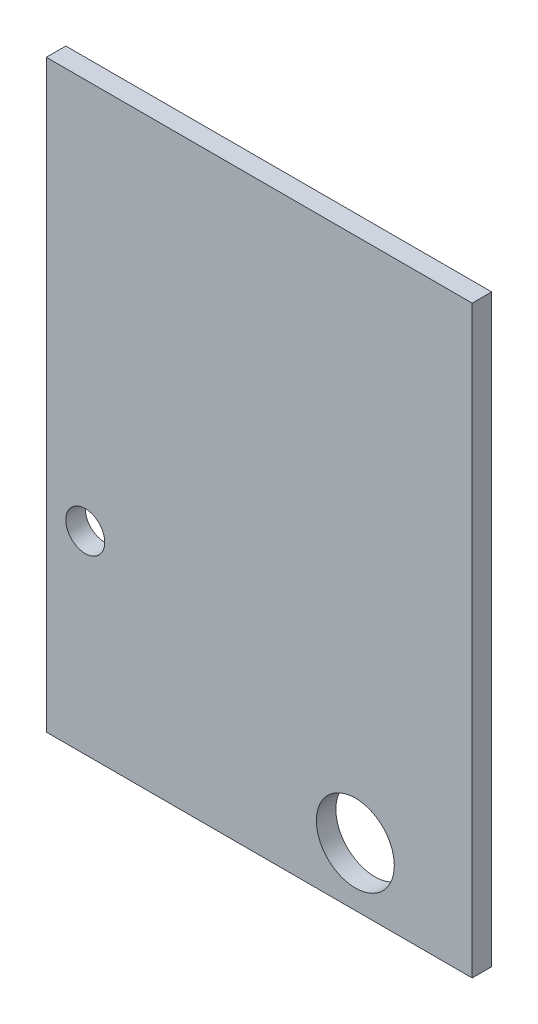
ISO-10303-21;
HEADER;
FILE_DESCRIPTION(('STEP AP214'),'2;1');
FILE_NAME('part.step','',(''),(''),'','','');
FILE_SCHEMA(('AUTOMOTIVE_DESIGN { 1 0 10303 214 1 1 1 1 }'));
ENDSEC;
DATA;
#1=APPLICATION_CONTEXT('core data for automotive mechanical design processes');
#2=APPLICATION_PROTOCOL_DEFINITION('international standard','automotive_design',2000,#1);
#3=PRODUCT_CONTEXT('',#1,'mechanical');
#4=PRODUCT('Part','Part','',(#3));
#5=PRODUCT_RELATED_PRODUCT_CATEGORY('part','',(#4));
#6=PRODUCT_DEFINITION_FORMATION('','',#4);
#7=PRODUCT_DEFINITION_CONTEXT('part definition',#1,'design');
#8=PRODUCT_DEFINITION('design','',#6,#7);
#9=PRODUCT_DEFINITION_SHAPE('','',#8);
#10=(LENGTH_UNIT() NAMED_UNIT(*) SI_UNIT(.MILLI.,.METRE.));
#11=(NAMED_UNIT(*) PLANE_ANGLE_UNIT() SI_UNIT($,.RADIAN.));
#12=(NAMED_UNIT(*) SI_UNIT($,.STERADIAN.) SOLID_ANGLE_UNIT());
#13=UNCERTAINTY_MEASURE_WITH_UNIT(LENGTH_MEASURE(1.E-05),#10,'distance_accuracy_value','');
#14=(GEOMETRIC_REPRESENTATION_CONTEXT(3) GLOBAL_UNCERTAINTY_ASSIGNED_CONTEXT((#13)) GLOBAL_UNIT_ASSIGNED_CONTEXT((#10,
#11,#12)) REPRESENTATION_CONTEXT('',''));
#15=CARTESIAN_POINT('',(0.,0.,0.));
#16=DIRECTION('',(0.,0.,1.));
#17=DIRECTION('',(1.,0.,0.));
#18=AXIS2_PLACEMENT_3D('',#15,#16,#17);
#19=CARTESIAN_POINT('',(0.,0.,10.));
#20=DIRECTION('',(0.,0.,1.));
#21=DIRECTION('',(1.,0.,0.));
#22=AXIS2_PLACEMENT_3D('',#19,#20,#21);
#23=PLANE('',#22);
#24=CARTESIAN_POINT('',(0.,0.,10.));
#25=DIRECTION('',(0.,0.,1.));
#26=DIRECTION('',(1.,0.,0.));
#27=AXIS2_PLACEMENT_3D('',#24,#25,#26);
#28=CIRCLE('',#27,20.);
#29=CARTESIAN_POINT('',(20.,0.,10.));
#30=VERTEX_POINT('',#29);
#31=EDGE_CURVE('E120',#30,#30,#28,.T.);
#32=ORIENTED_EDGE('',*,*,#31,.F.);
#33=EDGE_LOOP('',(#32));
#34=FACE_BOUND('',#33,.T.);
#35=DIRECTION('',(0.,-1.,0.));
#36=VECTOR('',#35,1.);
#37=CARTESIAN_POINT('',(-158.63,270.,10.));
#38=LINE('',#37,#36);
#39=CARTESIAN_POINT('',(-158.63,270.,10.));
#40=VERTEX_POINT('',#39);
#41=CARTESIAN_POINT('',(-158.63,-30.,10.));
#42=VERTEX_POINT('',#41);
#43=EDGE_CURVE('E100',#40,#42,#38,.T.);
#44=ORIENTED_EDGE('',*,*,#43,.T.);
#45=DIRECTION('',(1.,0.,0.));
#46=VECTOR('',#45,1.);
#47=CARTESIAN_POINT('',(-158.63,-30.,10.));
#48=LINE('',#47,#46);
#49=CARTESIAN_POINT('',(60.,-30.,10.));
#50=VERTEX_POINT('',#49);
#51=EDGE_CURVE('E95',#42,#50,#48,.T.);
#52=ORIENTED_EDGE('',*,*,#51,.T.);
#53=DIRECTION('',(0.,1.,0.));
#54=VECTOR('',#53,1.);
#55=CARTESIAN_POINT('',(60.,270.,10.));
#56=LINE('',#55,#54);
#57=CARTESIAN_POINT('',(60.,270.,10.));
#58=VERTEX_POINT('',#57);
#59=EDGE_CURVE('E98',#50,#58,#56,.T.);
#60=ORIENTED_EDGE('',*,*,#59,.T.);
#61=DIRECTION('',(-1.,0.,0.));
#62=VECTOR('',#61,1.);
#63=CARTESIAN_POINT('',(-158.63,270.,10.));
#64=LINE('',#63,#62);
#65=EDGE_CURVE('E61',#58,#40,#64,.T.);
#66=ORIENTED_EDGE('',*,*,#65,.T.);
#67=EDGE_LOOP('',(#44,#52,#60,#66));
#68=FACE_BOUND('',#67,.T.);
#69=CARTESIAN_POINT('',(-138.63,69.36,10.));
#70=DIRECTION('',(0.,0.,1.));
#71=DIRECTION('',(1.,0.,0.));
#72=AXIS2_PLACEMENT_3D('',#69,#70,#71);
#73=CIRCLE('',#72,9.99999999999998);
#74=CARTESIAN_POINT('',(-128.63,69.36,10.));
#75=VERTEX_POINT('',#74);
#76=EDGE_CURVE('E138',#75,#75,#73,.T.);
#77=ORIENTED_EDGE('',*,*,#76,.F.);
#78=EDGE_LOOP('',(#77));
#79=FACE_BOUND('',#78,.T.);
#80=ADVANCED_FACE('F43',(#34,#68,#79),#23,.T.);
#81=CARTESIAN_POINT('',(0.,0.,0.));
#82=DIRECTION('',(0.,0.,1.));
#83=DIRECTION('',(1.,0.,0.));
#84=AXIS2_PLACEMENT_3D('',#81,#82,#83);
#85=PLANE('',#84);
#86=DIRECTION('',(0.,-1.,0.));
#87=VECTOR('',#86,1.);
#88=CARTESIAN_POINT('',(-158.63,270.,0.));
#89=LINE('',#88,#87);
#90=CARTESIAN_POINT('',(-158.63,270.,0.));
#91=VERTEX_POINT('',#90);
#92=CARTESIAN_POINT('',(-158.63,-30.,0.));
#93=VERTEX_POINT('',#92);
#94=EDGE_CURVE('E116',#91,#93,#89,.T.);
#95=ORIENTED_EDGE('',*,*,#94,.F.);
#96=DIRECTION('',(-1.,0.,0.));
#97=VECTOR('',#96,1.);
#98=CARTESIAN_POINT('',(-158.63,270.,0.));
#99=LINE('',#98,#97);
#100=CARTESIAN_POINT('',(60.,270.,0.));
#101=VERTEX_POINT('',#100);
#102=EDGE_CURVE('E86',#101,#91,#99,.T.);
#103=ORIENTED_EDGE('',*,*,#102,.F.);
#104=DIRECTION('',(0.,1.,0.));
#105=VECTOR('',#104,1.);
#106=CARTESIAN_POINT('',(60.,270.,0.));
#107=LINE('',#106,#105);
#108=CARTESIAN_POINT('',(60.,-30.,0.));
#109=VERTEX_POINT('',#108);
#110=EDGE_CURVE('E80',#109,#101,#107,.T.);
#111=ORIENTED_EDGE('',*,*,#110,.F.);
#112=DIRECTION('',(1.,0.,0.));
#113=VECTOR('',#112,1.);
#114=CARTESIAN_POINT('',(-158.63,-30.,0.));
#115=LINE('',#114,#113);
#116=EDGE_CURVE('E105',#93,#109,#115,.T.);
#117=ORIENTED_EDGE('',*,*,#116,.F.);
#118=EDGE_LOOP('',(#95,#103,#111,#117));
#119=FACE_BOUND('',#118,.T.);
#120=CARTESIAN_POINT('',(0.,0.,0.));
#121=DIRECTION('',(0.,0.,1.));
#122=DIRECTION('',(1.,0.,0.));
#123=AXIS2_PLACEMENT_3D('',#120,#121,#122);
#124=CIRCLE('',#123,20.);
#125=CARTESIAN_POINT('',(20.,0.,0.));
#126=VERTEX_POINT('',#125);
#127=EDGE_CURVE('E134',#126,#126,#124,.T.);
#128=ORIENTED_EDGE('',*,*,#127,.T.);
#129=EDGE_LOOP('',(#128));
#130=FACE_BOUND('',#129,.T.);
#131=CARTESIAN_POINT('',(-138.63,69.36,0.));
#132=DIRECTION('',(0.,0.,1.));
#133=DIRECTION('',(1.,0.,0.));
#134=AXIS2_PLACEMENT_3D('',#131,#132,#133);
#135=CIRCLE('',#134,9.99999999999998);
#136=CARTESIAN_POINT('',(-128.63,69.36,0.));
#137=VERTEX_POINT('',#136);
#138=EDGE_CURVE('E142',#137,#137,#135,.T.);
#139=ORIENTED_EDGE('',*,*,#138,.T.);
#140=EDGE_LOOP('',(#139));
#141=FACE_BOUND('',#140,.T.);
#142=ADVANCED_FACE('F130',(#119,#130,#141),#85,.F.);
#143=CARTESIAN_POINT('',(-158.63,270.,10.));
#144=DIRECTION('',(1.,0.,0.));
#145=DIRECTION('',(0.,1.,0.));
#146=AXIS2_PLACEMENT_3D('',#143,#144,#145);
#147=PLANE('',#146);
#148=ORIENTED_EDGE('',*,*,#94,.T.);
#149=DIRECTION('',(0.,0.,-1.));
#150=VECTOR('',#149,1.);
#151=CARTESIAN_POINT('',(-158.63,-30.,10.));
#152=LINE('',#151,#150);
#153=EDGE_CURVE('E11',#42,#93,#152,.T.);
#154=ORIENTED_EDGE('',*,*,#153,.F.);
#155=ORIENTED_EDGE('',*,*,#43,.F.);
#156=DIRECTION('',(0.,0.,-1.));
#157=VECTOR('',#156,1.);
#158=CARTESIAN_POINT('',(-158.63,270.,10.));
#159=LINE('',#158,#157);
#160=EDGE_CURVE('E112',#40,#91,#159,.T.);
#161=ORIENTED_EDGE('',*,*,#160,.T.);
#162=EDGE_LOOP('',(#148,#154,#155,#161));
#163=FACE_BOUND('',#162,.T.);
#164=ADVANCED_FACE('F45',(#163),#147,.F.);
#165=CARTESIAN_POINT('',(-158.63,-30.,10.));
#166=DIRECTION('',(0.,1.,0.));
#167=DIRECTION('',(0.,0.,1.));
#168=AXIS2_PLACEMENT_3D('',#165,#166,#167);
#169=PLANE('',#168);
#170=ORIENTED_EDGE('',*,*,#116,.T.);
#171=DIRECTION('',(0.,0.,-1.));
#172=VECTOR('',#171,1.);
#173=CARTESIAN_POINT('',(60.,-30.,10.));
#174=LINE('',#173,#172);
#175=EDGE_CURVE('E53',#50,#109,#174,.T.);
#176=ORIENTED_EDGE('',*,*,#175,.F.);
#177=ORIENTED_EDGE('',*,*,#51,.F.);
#178=ORIENTED_EDGE('',*,*,#153,.T.);
#179=EDGE_LOOP('',(#170,#176,#177,#178));
#180=FACE_BOUND('',#179,.T.);
#181=ADVANCED_FACE('F104',(#180),#169,.F.);
#182=CARTESIAN_POINT('',(60.,270.,10.));
#183=DIRECTION('',(-1.,0.,0.));
#184=DIRECTION('',(0.,-1.,0.));
#185=AXIS2_PLACEMENT_3D('',#182,#183,#184);
#186=PLANE('',#185);
#187=ORIENTED_EDGE('',*,*,#110,.T.);
#188=DIRECTION('',(0.,0.,-1.));
#189=VECTOR('',#188,1.);
#190=CARTESIAN_POINT('',(60.,270.,10.));
#191=LINE('',#190,#189);
#192=EDGE_CURVE('E107',#58,#101,#191,.T.);
#193=ORIENTED_EDGE('',*,*,#192,.F.);
#194=ORIENTED_EDGE('',*,*,#59,.F.);
#195=ORIENTED_EDGE('',*,*,#175,.T.);
#196=EDGE_LOOP('',(#187,#193,#194,#195));
#197=FACE_BOUND('',#196,.T.);
#198=ADVANCED_FACE('F108',(#197),#186,.F.);
#199=CARTESIAN_POINT('',(-158.63,270.,10.));
#200=DIRECTION('',(0.,-1.,0.));
#201=DIRECTION('',(0.,0.,-1.));
#202=AXIS2_PLACEMENT_3D('',#199,#200,#201);
#203=PLANE('',#202);
#204=ORIENTED_EDGE('',*,*,#102,.T.);
#205=ORIENTED_EDGE('',*,*,#160,.F.);
#206=ORIENTED_EDGE('',*,*,#65,.F.);
#207=ORIENTED_EDGE('',*,*,#192,.T.);
#208=EDGE_LOOP('',(#204,#205,#206,#207));
#209=FACE_BOUND('',#208,.T.);
#210=ADVANCED_FACE('F127',(#209),#203,.F.);
#211=CARTESIAN_POINT('',(0.,0.,10.));
#212=DIRECTION('',(0.,0.,-1.));
#213=DIRECTION('',(-1.,0.,0.));
#214=AXIS2_PLACEMENT_3D('',#211,#212,#213);
#215=CYLINDRICAL_SURFACE('',#214,20.);
#216=ORIENTED_EDGE('',*,*,#31,.T.);
#217=EDGE_LOOP('',(#216));
#218=FACE_BOUND('',#217,.T.);
#219=ORIENTED_EDGE('',*,*,#127,.F.);
#220=EDGE_LOOP('',(#219));
#221=FACE_BOUND('',#220,.T.);
#222=ADVANCED_FACE('F159',(#218,#221),#215,.F.);
#223=CARTESIAN_POINT('',(-138.63,69.36,10.));
#224=DIRECTION('',(0.,0.,-1.));
#225=DIRECTION('',(-1.,0.,0.));
#226=AXIS2_PLACEMENT_3D('',#223,#224,#225);
#227=CYLINDRICAL_SURFACE('',#226,9.99999999999998);
#228=ORIENTED_EDGE('',*,*,#76,.T.);
#229=EDGE_LOOP('',(#228));
#230=FACE_BOUND('',#229,.T.);
#231=ORIENTED_EDGE('',*,*,#138,.F.);
#232=EDGE_LOOP('',(#231));
#233=FACE_BOUND('',#232,.T.);
#234=ADVANCED_FACE('F148',(#230,#233),#227,.F.);
#235=CLOSED_SHELL('',(#80,#142,#164,#181,#198,#210,#222,#234));
#236=MANIFOLD_SOLID_BREP('B2',#235);
#237=ADVANCED_BREP_SHAPE_REPRESENTATION('',(#18,#236),#14);
#238=SHAPE_DEFINITION_REPRESENTATION(#9,#237);
ENDSEC;
END-ISO-10303-21;
